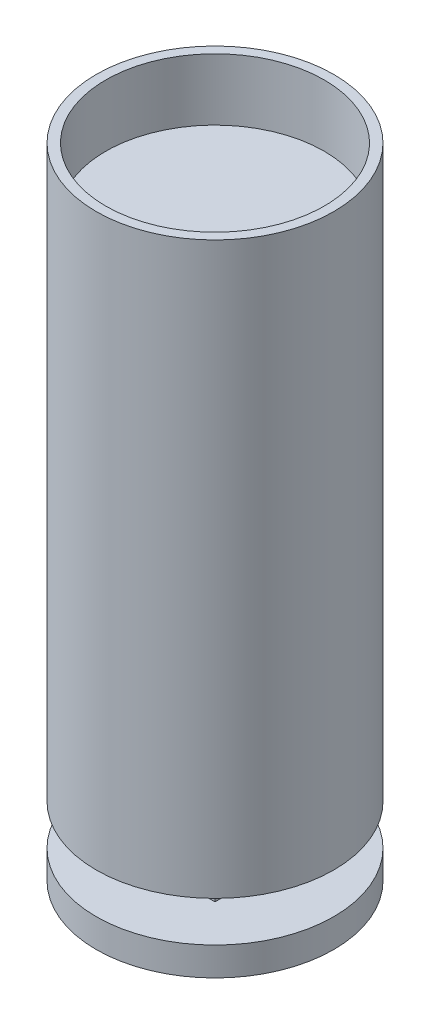
ISO-10303-21;
HEADER;
FILE_DESCRIPTION(('STEP AP214'),'2;1');
FILE_NAME('part.step','',(''),(''),'','','');
FILE_SCHEMA(('AUTOMOTIVE_DESIGN { 1 0 10303 214 1 1 1 1 }'));
ENDSEC;
DATA;
#1=APPLICATION_CONTEXT('core data for automotive mechanical design processes');
#2=APPLICATION_PROTOCOL_DEFINITION('international standard','automotive_design',2000,#1);
#3=PRODUCT_CONTEXT('',#1,'mechanical');
#4=PRODUCT('Part','Part','',(#3));
#5=PRODUCT_RELATED_PRODUCT_CATEGORY('part','',(#4));
#6=PRODUCT_DEFINITION_FORMATION('','',#4);
#7=PRODUCT_DEFINITION_CONTEXT('part definition',#1,'design');
#8=PRODUCT_DEFINITION('design','',#6,#7);
#9=PRODUCT_DEFINITION_SHAPE('','',#8);
#10=(LENGTH_UNIT() NAMED_UNIT(*) SI_UNIT(.MILLI.,.METRE.));
#11=(NAMED_UNIT(*) PLANE_ANGLE_UNIT() SI_UNIT($,.RADIAN.));
#12=(NAMED_UNIT(*) SI_UNIT($,.STERADIAN.) SOLID_ANGLE_UNIT());
#13=UNCERTAINTY_MEASURE_WITH_UNIT(LENGTH_MEASURE(1.E-05),#10,'distance_accuracy_value','');
#14=(GEOMETRIC_REPRESENTATION_CONTEXT(3) GLOBAL_UNCERTAINTY_ASSIGNED_CONTEXT((#13)) GLOBAL_UNIT_ASSIGNED_CONTEXT((#10,
#11,#12)) REPRESENTATION_CONTEXT('',''));
#15=CARTESIAN_POINT('',(0.,0.,0.));
#16=DIRECTION('',(0.,0.,1.));
#17=DIRECTION('',(1.,0.,0.));
#18=AXIS2_PLACEMENT_3D('',#15,#16,#17);
#19=CARTESIAN_POINT('',(0.,1.5,0.));
#20=DIRECTION('',(0.,-1.,0.));
#21=DIRECTION('',(0.,0.,-1.));
#22=AXIS2_PLACEMENT_3D('',#19,#20,#21);
#23=CYLINDRICAL_SURFACE('',#22,12.5);
#24=CARTESIAN_POINT('',(0.,1.5,0.));
#25=DIRECTION('',(0.,1.,0.));
#26=DIRECTION('',(0.,0.,1.));
#27=AXIS2_PLACEMENT_3D('',#24,#25,#26);
#28=CIRCLE('',#27,12.5);
#29=CARTESIAN_POINT('',(0.,1.5,12.5));
#30=VERTEX_POINT('',#29);
#31=EDGE_CURVE('E47',#30,#30,#28,.T.);
#32=ORIENTED_EDGE('',*,*,#31,.F.);
#33=EDGE_LOOP('',(#32));
#34=FACE_BOUND('',#33,.T.);
#35=CARTESIAN_POINT('',(0.,-1.5,0.));
#36=DIRECTION('',(0.,1.,0.));
#37=DIRECTION('',(0.,0.,1.));
#38=AXIS2_PLACEMENT_3D('',#35,#36,#37);
#39=CIRCLE('',#38,12.5);
#40=CARTESIAN_POINT('',(0.,-1.5,12.5));
#41=VERTEX_POINT('',#40);
#42=EDGE_CURVE('E130',#41,#41,#39,.T.);
#43=ORIENTED_EDGE('',*,*,#42,.T.);
#44=EDGE_LOOP('',(#43));
#45=FACE_BOUND('',#44,.T.);
#46=ADVANCED_FACE('F39',(#34,#45),#23,.T.);
#47=CARTESIAN_POINT('',(0.,1.5,0.));
#48=DIRECTION('',(0.,1.,0.));
#49=DIRECTION('',(0.,0.,1.));
#50=AXIS2_PLACEMENT_3D('',#47,#48,#49);
#51=PLANE('',#50);
#52=DIRECTION('',(0.,0.,1.));
#53=VECTOR('',#52,1.);
#54=CARTESIAN_POINT('',(-4.9,1.5,4.9));
#55=LINE('',#54,#53);
#56=CARTESIAN_POINT('',(-4.9,1.5,-4.9));
#57=VERTEX_POINT('',#56);
#58=CARTESIAN_POINT('',(-4.9,1.5,4.9));
#59=VERTEX_POINT('',#58);
#60=EDGE_CURVE('E54',#57,#59,#55,.T.);
#61=ORIENTED_EDGE('',*,*,#60,.F.);
#62=DIRECTION('',(-1.,0.,0.));
#63=VECTOR('',#62,1.);
#64=CARTESIAN_POINT('',(4.9,1.5,-4.9));
#65=LINE('',#64,#63);
#66=CARTESIAN_POINT('',(4.9,1.5,-4.9));
#67=VERTEX_POINT('',#66);
#68=EDGE_CURVE('E58',#67,#57,#65,.T.);
#69=ORIENTED_EDGE('',*,*,#68,.F.);
#70=DIRECTION('',(0.,0.,-1.));
#71=VECTOR('',#70,1.);
#72=CARTESIAN_POINT('',(4.9,1.5,4.9));
#73=LINE('',#72,#71);
#74=CARTESIAN_POINT('',(4.9,1.5,4.9));
#75=VERTEX_POINT('',#74);
#76=EDGE_CURVE('E117',#75,#67,#73,.T.);
#77=ORIENTED_EDGE('',*,*,#76,.F.);
#78=DIRECTION('',(1.,0.,0.));
#79=VECTOR('',#78,1.);
#80=CARTESIAN_POINT('',(4.9,1.5,4.9));
#81=LINE('',#80,#79);
#82=EDGE_CURVE('E112',#59,#75,#81,.T.);
#83=ORIENTED_EDGE('',*,*,#82,.F.);
#84=EDGE_LOOP('',(#61,#69,#77,#83));
#85=FACE_BOUND('',#84,.T.);
#86=ORIENTED_EDGE('',*,*,#31,.T.);
#87=EDGE_LOOP('',(#86));
#88=FACE_BOUND('',#87,.T.);
#89=ADVANCED_FACE('F140',(#85,#88),#51,.T.);
#90=CARTESIAN_POINT('',(0.,-1.5,0.));
#91=DIRECTION('',(0.,1.,0.));
#92=DIRECTION('',(0.,0.,1.));
#93=AXIS2_PLACEMENT_3D('',#90,#91,#92);
#94=PLANE('',#93);
#95=ORIENTED_EDGE('',*,*,#42,.F.);
#96=EDGE_LOOP('',(#95));
#97=FACE_BOUND('',#96,.T.);
#98=ADVANCED_FACE('F138',(#97),#94,.F.);
#99=CARTESIAN_POINT('',(-4.9,5.75,4.9));
#100=DIRECTION('',(1.,0.,0.));
#101=DIRECTION('',(0.,0.,-1.));
#102=AXIS2_PLACEMENT_3D('',#99,#100,#101);
#103=PLANE('',#102);
#104=ORIENTED_EDGE('',*,*,#60,.T.);
#105=DIRECTION('',(0.,-1.,0.));
#106=VECTOR('',#105,1.);
#107=CARTESIAN_POINT('',(-4.9,5.75,4.9));
#108=LINE('',#107,#106);
#109=CARTESIAN_POINT('',(-4.9,5.75,4.9));
#110=VERTEX_POINT('',#109);
#111=EDGE_CURVE('E84',#110,#59,#108,.T.);
#112=ORIENTED_EDGE('',*,*,#111,.F.);
#113=DIRECTION('',(0.,0.,1.));
#114=VECTOR('',#113,1.);
#115=CARTESIAN_POINT('',(-4.9,5.75,4.9));
#116=LINE('',#115,#114);
#117=CARTESIAN_POINT('',(-4.9,5.75,-4.9));
#118=VERTEX_POINT('',#117);
#119=EDGE_CURVE('E79',#118,#110,#116,.T.);
#120=ORIENTED_EDGE('',*,*,#119,.F.);
#121=DIRECTION('',(0.,-1.,0.));
#122=VECTOR('',#121,1.);
#123=CARTESIAN_POINT('',(-4.9,5.75,-4.9));
#124=LINE('',#123,#122);
#125=EDGE_CURVE('E82',#118,#57,#124,.T.);
#126=ORIENTED_EDGE('',*,*,#125,.T.);
#127=EDGE_LOOP('',(#104,#112,#120,#126));
#128=FACE_BOUND('',#127,.T.);
#129=ADVANCED_FACE('F81',(#128),#103,.F.);
#130=CARTESIAN_POINT('',(4.9,5.75,4.9));
#131=DIRECTION('',(0.,0.,-1.));
#132=DIRECTION('',(-1.,0.,0.));
#133=AXIS2_PLACEMENT_3D('',#130,#131,#132);
#134=PLANE('',#133);
#135=ORIENTED_EDGE('',*,*,#82,.T.);
#136=DIRECTION('',(0.,-1.,0.));
#137=VECTOR('',#136,1.);
#138=CARTESIAN_POINT('',(4.9,5.75,4.9));
#139=LINE('',#138,#137);
#140=CARTESIAN_POINT('',(4.9,5.75,4.9));
#141=VERTEX_POINT('',#140);
#142=EDGE_CURVE('E124',#141,#75,#139,.T.);
#143=ORIENTED_EDGE('',*,*,#142,.F.);
#144=DIRECTION('',(1.,0.,0.));
#145=VECTOR('',#144,1.);
#146=CARTESIAN_POINT('',(4.9,5.75,4.9));
#147=LINE('',#146,#145);
#148=EDGE_CURVE('E89',#110,#141,#147,.T.);
#149=ORIENTED_EDGE('',*,*,#148,.F.);
#150=ORIENTED_EDGE('',*,*,#111,.T.);
#151=EDGE_LOOP('',(#135,#143,#149,#150));
#152=FACE_BOUND('',#151,.T.);
#153=ADVANCED_FACE('F145',(#152),#134,.F.);
#154=CARTESIAN_POINT('',(4.9,5.75,4.9));
#155=DIRECTION('',(-1.,0.,0.));
#156=DIRECTION('',(0.,0.,1.));
#157=AXIS2_PLACEMENT_3D('',#154,#155,#156);
#158=PLANE('',#157);
#159=ORIENTED_EDGE('',*,*,#76,.T.);
#160=DIRECTION('',(0.,-1.,0.));
#161=VECTOR('',#160,1.);
#162=CARTESIAN_POINT('',(4.9,5.75,-4.9));
#163=LINE('',#162,#161);
#164=CARTESIAN_POINT('',(4.9,5.75,-4.9));
#165=VERTEX_POINT('',#164);
#166=EDGE_CURVE('E98',#165,#67,#163,.T.);
#167=ORIENTED_EDGE('',*,*,#166,.F.);
#168=DIRECTION('',(0.,0.,-1.));
#169=VECTOR('',#168,1.);
#170=CARTESIAN_POINT('',(4.9,5.75,4.9));
#171=LINE('',#170,#169);
#172=EDGE_CURVE('E103',#141,#165,#171,.T.);
#173=ORIENTED_EDGE('',*,*,#172,.F.);
#174=ORIENTED_EDGE('',*,*,#142,.T.);
#175=EDGE_LOOP('',(#159,#167,#173,#174));
#176=FACE_BOUND('',#175,.T.);
#177=ADVANCED_FACE('F175',(#176),#158,.F.);
#178=CARTESIAN_POINT('',(4.9,5.75,-4.9));
#179=DIRECTION('',(0.,0.,1.));
#180=DIRECTION('',(1.,0.,0.));
#181=AXIS2_PLACEMENT_3D('',#178,#179,#180);
#182=PLANE('',#181);
#183=ORIENTED_EDGE('',*,*,#68,.T.);
#184=ORIENTED_EDGE('',*,*,#125,.F.);
#185=DIRECTION('',(-1.,0.,0.));
#186=VECTOR('',#185,1.);
#187=CARTESIAN_POINT('',(4.9,5.75,-4.9));
#188=LINE('',#187,#186);
#189=EDGE_CURVE('E95',#165,#118,#188,.T.);
#190=ORIENTED_EDGE('',*,*,#189,.F.);
#191=ORIENTED_EDGE('',*,*,#166,.T.);
#192=EDGE_LOOP('',(#183,#184,#190,#191));
#193=FACE_BOUND('',#192,.T.);
#194=ADVANCED_FACE('F93',(#193),#182,.F.);
#195=CARTESIAN_POINT('',(0.,5.75,0.));
#196=DIRECTION('',(0.,1.,0.));
#197=DIRECTION('',(0.,0.,1.));
#198=AXIS2_PLACEMENT_3D('',#195,#196,#197);
#199=CYLINDRICAL_SURFACE('',#198,12.5);
#200=CARTESIAN_POINT('',(0.,5.75,0.));
#201=DIRECTION('',(0.,1.,0.));
#202=DIRECTION('',(0.,0.,1.));
#203=AXIS2_PLACEMENT_3D('',#200,#201,#202);
#204=CIRCLE('',#203,12.5);
#205=CARTESIAN_POINT('',(0.,5.75,12.5));
#206=VERTEX_POINT('',#205);
#207=EDGE_CURVE('E113',#206,#206,#204,.T.);
#208=ORIENTED_EDGE('',*,*,#207,.T.);
#209=EDGE_LOOP('',(#208));
#210=FACE_BOUND('',#209,.T.);
#211=CARTESIAN_POINT('',(0.,65.75,0.));
#212=DIRECTION('',(0.,1.,0.));
#213=DIRECTION('',(0.,0.,1.));
#214=AXIS2_PLACEMENT_3D('',#211,#212,#213);
#215=CIRCLE('',#214,12.5);
#216=CARTESIAN_POINT('',(0.,65.75,12.5));
#217=VERTEX_POINT('',#216);
#218=EDGE_CURVE('E261',#217,#217,#215,.T.);
#219=ORIENTED_EDGE('',*,*,#218,.F.);
#220=EDGE_LOOP('',(#219));
#221=FACE_BOUND('',#220,.T.);
#222=ADVANCED_FACE('F194',(#210,#221),#199,.T.);
#223=CARTESIAN_POINT('',(0.,5.75,0.));
#224=DIRECTION('',(0.,-1.,0.));
#225=DIRECTION('',(0.,0.,1.));
#226=AXIS2_PLACEMENT_3D('',#223,#224,#225);
#227=PLANE('',#226);
#228=ORIENTED_EDGE('',*,*,#189,.T.);
#229=ORIENTED_EDGE('',*,*,#119,.T.);
#230=ORIENTED_EDGE('',*,*,#148,.T.);
#231=ORIENTED_EDGE('',*,*,#172,.T.);
#232=EDGE_LOOP('',(#228,#229,#230,#231));
#233=FACE_BOUND('',#232,.T.);
#234=ORIENTED_EDGE('',*,*,#207,.F.);
#235=EDGE_LOOP('',(#234));
#236=FACE_BOUND('',#235,.T.);
#237=ADVANCED_FACE('F100',(#233,#236),#227,.T.);
#238=CARTESIAN_POINT('',(0.,65.75,0.));
#239=DIRECTION('',(0.,1.,0.));
#240=DIRECTION('',(0.,0.,1.));
#241=AXIS2_PLACEMENT_3D('',#238,#239,#240);
#242=PLANE('',#241);
#243=ORIENTED_EDGE('',*,*,#218,.T.);
#244=EDGE_LOOP('',(#243));
#245=FACE_BOUND('',#244,.T.);
#246=CARTESIAN_POINT('',(0.,65.75,0.));
#247=DIRECTION('',(0.,1.,0.));
#248=DIRECTION('',(0.,0.,1.));
#249=AXIS2_PLACEMENT_3D('',#246,#247,#248);
#250=CIRCLE('',#249,11.5);
#251=CARTESIAN_POINT('',(0.,65.75,-11.5));
#252=VERTEX_POINT('',#251);
#253=EDGE_CURVE('E258',#252,#252,#250,.T.);
#254=ORIENTED_EDGE('',*,*,#253,.F.);
#255=EDGE_LOOP('',(#254));
#256=FACE_BOUND('',#255,.T.);
#257=ADVANCED_FACE('F205',(#245,#256),#242,.T.);
#258=CARTESIAN_POINT('',(0.,65.75,0.));
#259=DIRECTION('',(0.,-1.,0.));
#260=DIRECTION('',(0.,0.,-1.));
#261=AXIS2_PLACEMENT_3D('',#258,#259,#260);
#262=CYLINDRICAL_SURFACE('',#261,11.5);
#263=CARTESIAN_POINT('',(0.,59.25,0.));
#264=DIRECTION('',(0.,1.,0.));
#265=DIRECTION('',(0.,0.,1.));
#266=AXIS2_PLACEMENT_3D('',#263,#264,#265);
#267=CIRCLE('',#266,11.5);
#268=CARTESIAN_POINT('',(0.,59.25,-11.5));
#269=VERTEX_POINT('',#268);
#270=EDGE_CURVE('E11',#269,#269,#267,.F.);
#271=CARTESIAN_POINT('',(0.,65.75,-11.5));
#272=CARTESIAN_POINT('',(0.,65.6822916666667,-11.5));
#273=CARTESIAN_POINT('',(0.,65.6145833333333,-11.5));
#274=CARTESIAN_POINT('',(0.,65.4791666666667,-11.5));
#275=CARTESIAN_POINT('',(0.,65.4114583333333,-11.5));
#276=CARTESIAN_POINT('',(0.,65.2760416666667,-11.5));
#277=CARTESIAN_POINT('',(0.,65.2083333333333,-11.5));
#278=CARTESIAN_POINT('',(0.,65.0729166666667,-11.5));
#279=CARTESIAN_POINT('',(0.,65.0052083333333,-11.5));
#280=CARTESIAN_POINT('',(0.,64.8697916666667,-11.5));
#281=CARTESIAN_POINT('',(0.,64.8020833333333,-11.5));
#282=CARTESIAN_POINT('',(0.,64.6666666666667,-11.5));
#283=CARTESIAN_POINT('',(0.,64.5989583333333,-11.5));
#284=CARTESIAN_POINT('',(0.,64.4635416666667,-11.5));
#285=CARTESIAN_POINT('',(0.,64.3958333333333,-11.5));
#286=CARTESIAN_POINT('',(0.,64.2604166666667,-11.5));
#287=CARTESIAN_POINT('',(0.,64.1927083333333,-11.5));
#288=CARTESIAN_POINT('',(0.,64.0572916666667,-11.5));
#289=CARTESIAN_POINT('',(0.,63.9895833333333,-11.5));
#290=CARTESIAN_POINT('',(0.,63.8541666666667,-11.5));
#291=CARTESIAN_POINT('',(0.,63.7864583333333,-11.5));
#292=CARTESIAN_POINT('',(0.,63.6510416666667,-11.5));
#293=CARTESIAN_POINT('',(0.,63.5833333333333,-11.5));
#294=CARTESIAN_POINT('',(0.,63.4479166666667,-11.5));
#295=CARTESIAN_POINT('',(0.,63.3802083333333,-11.5));
#296=CARTESIAN_POINT('',(0.,63.2447916666667,-11.5));
#297=CARTESIAN_POINT('',(0.,63.1770833333333,-11.5));
#298=CARTESIAN_POINT('',(0.,63.0416666666667,-11.5));
#299=CARTESIAN_POINT('',(0.,62.9739583333333,-11.5));
#300=CARTESIAN_POINT('',(0.,62.8385416666667,-11.5));
#301=CARTESIAN_POINT('',(0.,62.7708333333333,-11.5));
#302=CARTESIAN_POINT('',(0.,62.6354166666667,-11.5));
#303=CARTESIAN_POINT('',(0.,62.5677083333333,-11.5));
#304=CARTESIAN_POINT('',(0.,62.4322916666667,-11.5));
#305=CARTESIAN_POINT('',(0.,62.3645833333333,-11.5));
#306=CARTESIAN_POINT('',(0.,62.2291666666667,-11.5));
#307=CARTESIAN_POINT('',(0.,62.1614583333333,-11.5));
#308=CARTESIAN_POINT('',(0.,62.0260416666667,-11.5));
#309=CARTESIAN_POINT('',(0.,61.9583333333333,-11.5));
#310=CARTESIAN_POINT('',(0.,61.8229166666667,-11.5));
#311=CARTESIAN_POINT('',(0.,61.7552083333333,-11.5));
#312=CARTESIAN_POINT('',(0.,61.6197916666667,-11.5));
#313=CARTESIAN_POINT('',(0.,61.5520833333333,-11.5));
#314=CARTESIAN_POINT('',(0.,61.4166666666667,-11.5));
#315=CARTESIAN_POINT('',(0.,61.3489583333333,-11.5));
#316=CARTESIAN_POINT('',(0.,61.2135416666667,-11.5));
#317=CARTESIAN_POINT('',(0.,61.1458333333333,-11.5));
#318=CARTESIAN_POINT('',(0.,61.0104166666667,-11.5));
#319=CARTESIAN_POINT('',(0.,60.9427083333333,-11.5));
#320=CARTESIAN_POINT('',(0.,60.8072916666667,-11.5));
#321=CARTESIAN_POINT('',(0.,60.7395833333333,-11.5));
#322=CARTESIAN_POINT('',(0.,60.6041666666667,-11.5));
#323=CARTESIAN_POINT('',(0.,60.5364583333333,-11.5));
#324=CARTESIAN_POINT('',(0.,60.4010416666667,-11.5));
#325=CARTESIAN_POINT('',(0.,60.3333333333333,-11.5));
#326=CARTESIAN_POINT('',(0.,60.1979166666667,-11.5));
#327=CARTESIAN_POINT('',(0.,60.1302083333333,-11.5));
#328=CARTESIAN_POINT('',(0.,59.9947916666667,-11.5));
#329=CARTESIAN_POINT('',(0.,59.9270833333333,-11.5));
#330=CARTESIAN_POINT('',(0.,59.7916666666667,-11.5));
#331=CARTESIAN_POINT('',(0.,59.7239583333333,-11.5));
#332=CARTESIAN_POINT('',(0.,59.5885416666667,-11.5));
#333=CARTESIAN_POINT('',(0.,59.5208333333333,-11.5));
#334=CARTESIAN_POINT('',(0.,59.3854166666667,-11.5));
#335=CARTESIAN_POINT('',(0.,59.3177083333333,-11.5));
#336=CARTESIAN_POINT('',(0.,59.25,-11.5));
#337=B_SPLINE_CURVE_WITH_KNOTS('',3,(#271,#272,#273,#274,#275,#276,#277,#278,#279,#280,#281,
#282,#283,#284,#285,#286,#287,#288,#289,#290,#291,#292,#293,#294,#295,#296,#297,#298,#299,#300,
#301,#302,#303,#304,#305,#306,#307,#308,#309,#310,#311,#312,#313,#314,#315,#316,#317,#318,#319,
#320,#321,#322,#323,#324,#325,#326,#327,#328,#329,#330,#331,#332,#333,#334,#335,#336),
.UNSPECIFIED.,.F.,.F.,(4,2,2,2,2,2,2,2,2,2,2,2,2,2,2,2,2,2,2,2,2,2,2,2,2,2,2,2,2,2,2,2,4),(0.,
0.203124999999998,0.406249999999997,0.609374999999995,0.812499999999994,1.01562499999999,
1.21874999999999,1.42187499999999,1.62499999999999,1.82812499999999,2.03124999999998,2.234375,
2.4375,2.64062499999999,2.84374999999999,3.04687499999999,3.24999999999999,3.45312499999999,
3.65624999999999,3.85937499999999,4.06249999999999,4.26562499999999,4.46874999999999,
4.67187499999999,4.87499999999999,5.07812499999999,5.28124999999999,5.48437499999999,
5.68749999999999,5.89062499999999,6.09374999999999,6.29687499999999,6.49999999999998),.UNSPECIFIED.);
#338=EDGE_CURVE('BSEAM225',#252,#269,#337,.T.);
#339=ORIENTED_EDGE('',*,*,#253,.T.);
#340=ORIENTED_EDGE('',*,*,#270,.T.);
#341=ORIENTED_EDGE('',*,*,#338,.T.);
#342=ORIENTED_EDGE('',*,*,#338,.F.);
#343=EDGE_LOOP('',(#339,#341,#340,#342));
#344=FACE_BOUND('',#343,.T.);
#345=ADVANCED_FACE('F225',(#344),#262,.F.);
#346=CARTESIAN_POINT('',(0.,59.25,0.));
#347=DIRECTION('',(0.,1.,0.));
#348=DIRECTION('',(0.,0.,1.));
#349=AXIS2_PLACEMENT_3D('',#346,#347,#348);
#350=PLANE('',#349);
#351=ORIENTED_EDGE('',*,*,#270,.F.);
#352=EDGE_LOOP('',(#351));
#353=FACE_BOUND('',#352,.T.);
#354=ADVANCED_FACE('F235',(#353),#350,.T.);
#355=CLOSED_SHELL('',(#46,#89,#98,#129,#153,#177,#194,#222,#237,#257,#345,#354));
#356=MANIFOLD_SOLID_BREP('B2',#355);
#357=ADVANCED_BREP_SHAPE_REPRESENTATION('',(#18,#356),#14);
#358=SHAPE_DEFINITION_REPRESENTATION(#9,#357);
ENDSEC;
END-ISO-10303-21;
